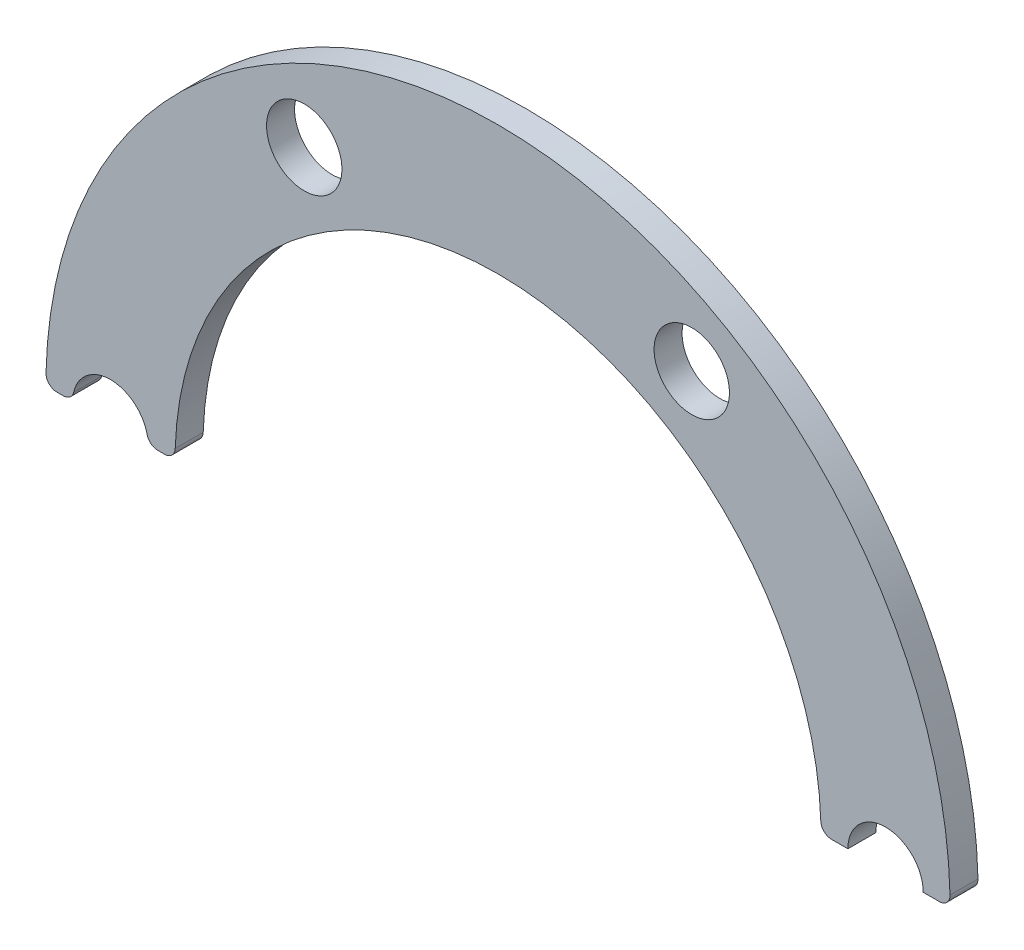
ISO-10303-21;
HEADER;
FILE_DESCRIPTION(('STEP AP214'),'2;1');
FILE_NAME('part.step','',(''),(''),'','','');
FILE_SCHEMA(('AUTOMOTIVE_DESIGN { 1 0 10303 214 1 1 1 1 }'));
ENDSEC;
DATA;
#1=APPLICATION_CONTEXT('core data for automotive mechanical design processes');
#2=APPLICATION_PROTOCOL_DEFINITION('international standard','automotive_design',2000,#1);
#3=PRODUCT_CONTEXT('',#1,'mechanical');
#4=PRODUCT('Part','Part','',(#3));
#5=PRODUCT_RELATED_PRODUCT_CATEGORY('part','',(#4));
#6=PRODUCT_DEFINITION_FORMATION('','',#4);
#7=PRODUCT_DEFINITION_CONTEXT('part definition',#1,'design');
#8=PRODUCT_DEFINITION('design','',#6,#7);
#9=PRODUCT_DEFINITION_SHAPE('','',#8);
#10=(LENGTH_UNIT() NAMED_UNIT(*) SI_UNIT(.MILLI.,.METRE.));
#11=(NAMED_UNIT(*) PLANE_ANGLE_UNIT() SI_UNIT($,.RADIAN.));
#12=(NAMED_UNIT(*) SI_UNIT($,.STERADIAN.) SOLID_ANGLE_UNIT());
#13=UNCERTAINTY_MEASURE_WITH_UNIT(LENGTH_MEASURE(1.E-05),#10,'distance_accuracy_value','');
#14=(GEOMETRIC_REPRESENTATION_CONTEXT(3) GLOBAL_UNCERTAINTY_ASSIGNED_CONTEXT((#13)) GLOBAL_UNIT_ASSIGNED_CONTEXT((#10,
#11,#12)) REPRESENTATION_CONTEXT('',''));
#15=CARTESIAN_POINT('',(0.,0.,0.));
#16=DIRECTION('',(0.,0.,1.));
#17=DIRECTION('',(1.,0.,0.));
#18=AXIS2_PLACEMENT_3D('',#15,#16,#17);
#19=CARTESIAN_POINT('',(38.1,0.,3.302));
#20=DIRECTION('',(0.,1.,0.));
#21=DIRECTION('',(-1.,0.,0.));
#22=AXIS2_PLACEMENT_3D('',#19,#20,#21);
#23=PLANE('',#22);
#24=DIRECTION('',(1.,0.,0.));
#25=VECTOR('',#24,1.);
#26=CARTESIAN_POINT('',(38.1,0.,3.302));
#27=LINE('',#26,#25);
#28=CARTESIAN_POINT('',(39.3495107974674,0.,3.302));
#29=VERTEX_POINT('',#28);
#30=CARTESIAN_POINT('',(41.275,0.,3.302));
#31=VERTEX_POINT('',#30);
#32=EDGE_CURVE('E248',#29,#31,#27,.T.);
#33=ORIENTED_EDGE('',*,*,#32,.F.);
#34=DIRECTION('',(0.,0.,-1.));
#35=VECTOR('',#34,1.);
#36=CARTESIAN_POINT('',(39.3495107974674,0.,3.302));
#37=LINE('',#36,#35);
#38=CARTESIAN_POINT('',(39.3495107974674,0.,0.));
#39=VERTEX_POINT('',#38);
#40=EDGE_CURVE('E207',#29,#39,#37,.T.);
#41=ORIENTED_EDGE('',*,*,#40,.T.);
#42=DIRECTION('',(1.,0.,0.));
#43=VECTOR('',#42,1.);
#44=CARTESIAN_POINT('',(38.1,0.,0.));
#45=LINE('',#44,#43);
#46=CARTESIAN_POINT('',(41.275,0.,0.));
#47=VERTEX_POINT('',#46);
#48=EDGE_CURVE('E164',#39,#47,#45,.T.);
#49=ORIENTED_EDGE('',*,*,#48,.T.);
#50=DIRECTION('',(0.,0.,1.));
#51=VECTOR('',#50,1.);
#52=CARTESIAN_POINT('',(41.275,0.,0.));
#53=LINE('',#52,#51);
#54=EDGE_CURVE('E144',#47,#31,#53,.T.);
#55=ORIENTED_EDGE('',*,*,#54,.T.);
#56=EDGE_LOOP('',(#33,#41,#49,#55));
#57=FACE_BOUND('',#56,.T.);
#58=ADVANCED_FACE('F34',(#57),#23,.F.);
#59=CARTESIAN_POINT('',(-38.1,0.,3.302));
#60=DIRECTION('',(0.,1.,0.));
#61=DIRECTION('',(-1.,0.,0.));
#62=AXIS2_PLACEMENT_3D('',#59,#60,#61);
#63=PLANE('',#62);
#64=DIRECTION('',(1.,0.,0.));
#65=VECTOR('',#64,1.);
#66=CARTESIAN_POINT('',(-38.1,0.,0.));
#67=LINE('',#66,#65);
#68=CARTESIAN_POINT('',(-52.0545098910748,0.,0.));
#69=VERTEX_POINT('',#68);
#70=CARTESIAN_POINT('',(-51.292102385994,0.,0.));
#71=VERTEX_POINT('',#70);
#72=EDGE_CURVE('E175',#69,#71,#67,.T.);
#73=ORIENTED_EDGE('',*,*,#72,.T.);
#74=DIRECTION('',(0.,0.,1.));
#75=VECTOR('',#74,1.);
#76=CARTESIAN_POINT('',(-51.292102385994,0.,3.302));
#77=LINE('',#76,#75);
#78=CARTESIAN_POINT('',(-51.292102385994,0.,3.302));
#79=VERTEX_POINT('',#78);
#80=EDGE_CURVE('E11',#71,#79,#77,.T.);
#81=ORIENTED_EDGE('',*,*,#80,.T.);
#82=DIRECTION('',(1.,0.,0.));
#83=VECTOR('',#82,1.);
#84=CARTESIAN_POINT('',(-38.1,0.,3.302));
#85=LINE('',#84,#83);
#86=CARTESIAN_POINT('',(-52.0545098910748,0.,3.302));
#87=VERTEX_POINT('',#86);
#88=EDGE_CURVE('E149',#87,#79,#85,.T.);
#89=ORIENTED_EDGE('',*,*,#88,.F.);
#90=DIRECTION('',(0.,0.,-1.));
#91=VECTOR('',#90,1.);
#92=CARTESIAN_POINT('',(-52.0545098910748,0.,3.302));
#93=LINE('',#92,#91);
#94=EDGE_CURVE('E42',#87,#69,#93,.T.);
#95=ORIENTED_EDGE('',*,*,#94,.T.);
#96=EDGE_LOOP('',(#73,#81,#89,#95));
#97=FACE_BOUND('',#96,.T.);
#98=ADVANCED_FACE('F227',(#97),#63,.F.);
#99=CARTESIAN_POINT('',(0.,0.,3.302));
#100=DIRECTION('',(0.,0.,-1.));
#101=DIRECTION('',(-1.,0.,0.));
#102=AXIS2_PLACEMENT_3D('',#99,#100,#101);
#103=CYLINDRICAL_SURFACE('',#102,38.1);
#104=CARTESIAN_POINT('',(0.,0.,0.));
#105=DIRECTION('',(0.,0.,-1.));
#106=DIRECTION('',(1.,0.,0.));
#107=AXIS2_PLACEMENT_3D('',#104,#105,#106);
#108=CIRCLE('',#107,38.1);
#109=CARTESIAN_POINT('',(-38.0801717394845,1.22903225806452,0.));
#110=VERTEX_POINT('',#109);
#111=CARTESIAN_POINT('',(38.0801717394845,1.22903225806452,0.));
#112=VERTEX_POINT('',#111);
#113=EDGE_CURVE('E165',#110,#112,#108,.T.);
#114=ORIENTED_EDGE('',*,*,#113,.T.);
#115=DIRECTION('',(0.,0.,-1.));
#116=VECTOR('',#115,1.);
#117=CARTESIAN_POINT('',(38.0801717394845,1.22903225806452,3.302));
#118=LINE('',#117,#116);
#119=CARTESIAN_POINT('',(38.0801717394845,1.22903225806452,3.302));
#120=VERTEX_POINT('',#119);
#121=EDGE_CURVE('E57',#112,#120,#118,.F.);
#122=ORIENTED_EDGE('',*,*,#121,.T.);
#123=CARTESIAN_POINT('',(0.,0.,3.302));
#124=DIRECTION('',(0.,0.,-1.));
#125=DIRECTION('',(1.,0.,0.));
#126=AXIS2_PLACEMENT_3D('',#123,#124,#125);
#127=CIRCLE('',#126,38.1);
#128=CARTESIAN_POINT('',(-38.0801717394845,1.22903225806452,3.302));
#129=VERTEX_POINT('',#128);
#130=EDGE_CURVE('E177',#129,#120,#127,.T.);
#131=ORIENTED_EDGE('',*,*,#130,.F.);
#132=DIRECTION('',(0.,0.,-1.));
#133=VECTOR('',#132,1.);
#134=CARTESIAN_POINT('',(-38.0801717394845,1.22903225806452,3.302));
#135=LINE('',#134,#133);
#136=EDGE_CURVE('E210',#129,#110,#135,.T.);
#137=ORIENTED_EDGE('',*,*,#136,.T.);
#138=EDGE_LOOP('',(#114,#122,#131,#137));
#139=FACE_BOUND('',#138,.T.);
#140=ADVANCED_FACE('F297',(#139),#103,.F.);
#141=CARTESIAN_POINT('',(50.165,0.,0.));
#142=VERTEX_POINT('',#141);
#143=CARTESIAN_POINT('',(52.0545098910748,0.,0.));
#144=VERTEX_POINT('',#143);
#145=EDGE_CURVE('E155',#142,#144,#45,.T.);
#146=ORIENTED_EDGE('',*,*,#145,.T.);
#147=DIRECTION('',(0.,0.,-1.));
#148=VECTOR('',#147,1.);
#149=CARTESIAN_POINT('',(52.0545098910748,0.,3.302));
#150=LINE('',#149,#148);
#151=CARTESIAN_POINT('',(52.0545098910748,0.,3.302));
#152=VERTEX_POINT('',#151);
#153=EDGE_CURVE('E194',#144,#152,#150,.F.);
#154=ORIENTED_EDGE('',*,*,#153,.T.);
#155=CARTESIAN_POINT('',(50.165,0.,3.302));
#156=VERTEX_POINT('',#155);
#157=EDGE_CURVE('E158',#156,#152,#27,.T.);
#158=ORIENTED_EDGE('',*,*,#157,.F.);
#159=DIRECTION('',(0.,0.,1.));
#160=VECTOR('',#159,1.);
#161=CARTESIAN_POINT('',(50.165,0.,0.));
#162=LINE('',#161,#160);
#163=EDGE_CURVE('E141',#156,#142,#162,.F.);
#164=ORIENTED_EDGE('',*,*,#163,.T.);
#165=EDGE_LOOP('',(#146,#154,#158,#164));
#166=FACE_BOUND('',#165,.T.);
#167=ADVANCED_FACE('F154',(#166),#23,.F.);
#168=CARTESIAN_POINT('',(0.,0.,3.302));
#169=DIRECTION('',(0.,0.,-1.));
#170=DIRECTION('',(-1.,0.,0.));
#171=AXIS2_PLACEMENT_3D('',#168,#169,#170);
#172=CYLINDRICAL_SURFACE('',#171,53.34);
#173=CARTESIAN_POINT('',(0.,0.,3.302));
#174=DIRECTION('',(0.,0.,1.));
#175=DIRECTION('',(1.,0.,0.));
#176=AXIS2_PLACEMENT_3D('',#173,#174,#175);
#177=CIRCLE('',#176,53.34);
#178=CARTESIAN_POINT('',(53.32413208354,1.30097560975609,3.302));
#179=VERTEX_POINT('',#178);
#180=CARTESIAN_POINT('',(-53.32413208354,1.30097560975609,3.302));
#181=VERTEX_POINT('',#180);
#182=EDGE_CURVE('E245',#179,#181,#177,.T.);
#183=ORIENTED_EDGE('',*,*,#182,.F.);
#184=DIRECTION('',(0.,0.,-1.));
#185=VECTOR('',#184,1.);
#186=CARTESIAN_POINT('',(53.32413208354,1.30097560975609,3.302));
#187=LINE('',#186,#185);
#188=CARTESIAN_POINT('',(53.32413208354,1.30097560975609,0.));
#189=VERTEX_POINT('',#188);
#190=EDGE_CURVE('E180',#179,#189,#187,.T.);
#191=ORIENTED_EDGE('',*,*,#190,.T.);
#192=CARTESIAN_POINT('',(0.,0.,0.));
#193=DIRECTION('',(0.,0.,1.));
#194=DIRECTION('',(1.,0.,0.));
#195=AXIS2_PLACEMENT_3D('',#192,#193,#194);
#196=CIRCLE('',#195,53.34);
#197=CARTESIAN_POINT('',(-53.32413208354,1.30097560975609,0.));
#198=VERTEX_POINT('',#197);
#199=EDGE_CURVE('E167',#189,#198,#196,.T.);
#200=ORIENTED_EDGE('',*,*,#199,.T.);
#201=DIRECTION('',(0.,0.,-1.));
#202=VECTOR('',#201,1.);
#203=CARTESIAN_POINT('',(-53.32413208354,1.30097560975609,3.302));
#204=LINE('',#203,#202);
#205=EDGE_CURVE('E148',#198,#181,#204,.F.);
#206=ORIENTED_EDGE('',*,*,#205,.T.);
#207=EDGE_LOOP('',(#183,#191,#200,#206));
#208=FACE_BOUND('',#207,.T.);
#209=ADVANCED_FACE('F287',(#208),#172,.T.);
#210=CARTESIAN_POINT('',(-40.147897614006,0.,3.302));
#211=VERTEX_POINT('',#210);
#212=CARTESIAN_POINT('',(-39.3495107974674,0.,3.302));
#213=VERTEX_POINT('',#212);
#214=EDGE_CURVE('E243',#211,#213,#85,.T.);
#215=ORIENTED_EDGE('',*,*,#214,.F.);
#216=DIRECTION('',(0.,0.,1.));
#217=VECTOR('',#216,1.);
#218=CARTESIAN_POINT('',(-40.147897614006,0.,3.302));
#219=LINE('',#218,#217);
#220=CARTESIAN_POINT('',(-40.147897614006,0.,0.));
#221=VERTEX_POINT('',#220);
#222=EDGE_CURVE('E216',#211,#221,#219,.F.);
#223=ORIENTED_EDGE('',*,*,#222,.T.);
#224=CARTESIAN_POINT('',(-39.3495107974674,0.,0.));
#225=VERTEX_POINT('',#224);
#226=EDGE_CURVE('E174',#221,#225,#67,.T.);
#227=ORIENTED_EDGE('',*,*,#226,.T.);
#228=DIRECTION('',(0.,0.,-1.));
#229=VECTOR('',#228,1.);
#230=CARTESIAN_POINT('',(-39.3495107974674,0.,3.302));
#231=LINE('',#230,#229);
#232=EDGE_CURVE('E214',#225,#213,#231,.F.);
#233=ORIENTED_EDGE('',*,*,#232,.T.);
#234=EDGE_LOOP('',(#215,#223,#227,#233));
#235=FACE_BOUND('',#234,.T.);
#236=ADVANCED_FACE('F279',(#235),#63,.F.);
#237=CARTESIAN_POINT('',(0.,0.,3.302));
#238=DIRECTION('',(0.,0.,1.));
#239=DIRECTION('',(1.,0.,0.));
#240=AXIS2_PLACEMENT_3D('',#237,#238,#239);
#241=PLANE('',#240);
#242=CARTESIAN_POINT('',(22.8600000000002,39.5946814610244,3.302));
#243=DIRECTION('',(0.,0.,1.));
#244=DIRECTION('',(-0.500000000000004,-0.866025403784436,0.));
#245=AXIS2_PLACEMENT_3D('',#242,#243,#244);
#246=CIRCLE('',#245,4.445);
#247=CARTESIAN_POINT('',(20.6375000000002,35.7451985412026,3.302));
#248=VERTEX_POINT('',#247);
#249=EDGE_CURVE('E263',#248,#248,#246,.T.);
#250=ORIENTED_EDGE('',*,*,#249,.F.);
#251=EDGE_LOOP('',(#250));
#252=FACE_BOUND('',#251,.T.);
#253=ORIENTED_EDGE('',*,*,#157,.T.);
#254=CARTESIAN_POINT('',(52.0545098910748,1.27,3.302));
#255=DIRECTION('',(0.,0.,1.));
#256=DIRECTION('',(1.,0.,0.));
#257=AXIS2_PLACEMENT_3D('',#254,#255,#256);
#258=CIRCLE('',#257,1.27);
#259=EDGE_CURVE('E205',#152,#179,#258,.T.);
#260=ORIENTED_EDGE('',*,*,#259,.T.);
#261=ORIENTED_EDGE('',*,*,#182,.T.);
#262=CARTESIAN_POINT('',(-52.0545098910748,1.27,3.302));
#263=DIRECTION('',(0.,0.,1.));
#264=DIRECTION('',(1.,0.,0.));
#265=AXIS2_PLACEMENT_3D('',#262,#263,#264);
#266=CIRCLE('',#265,1.27);
#267=EDGE_CURVE('E196',#181,#87,#266,.T.);
#268=ORIENTED_EDGE('',*,*,#267,.T.);
#269=ORIENTED_EDGE('',*,*,#88,.T.);
#270=CARTESIAN_POINT('',(-51.292102385994,1.27,3.302));
#271=DIRECTION('',(0.,0.,1.));
#272=DIRECTION('',(1.,0.,0.));
#273=AXIS2_PLACEMENT_3D('',#270,#271,#272);
#274=CIRCLE('',#273,1.27);
#275=CARTESIAN_POINT('',(-50.0538574113287,0.987777777777774,3.302));
#276=VERTEX_POINT('',#275);
#277=EDGE_CURVE('E200',#79,#276,#274,.T.);
#278=ORIENTED_EDGE('',*,*,#277,.T.);
#279=CARTESIAN_POINT('',(-45.72,0.,3.302));
#280=DIRECTION('',(0.,0.,1.));
#281=DIRECTION('',(1.,0.,0.));
#282=AXIS2_PLACEMENT_3D('',#279,#280,#281);
#283=CIRCLE('',#282,4.445);
#284=CARTESIAN_POINT('',(-41.3861425886713,0.987777777777776,3.302));
#285=VERTEX_POINT('',#284);
#286=EDGE_CURVE('E251',#285,#276,#283,.T.);
#287=ORIENTED_EDGE('',*,*,#286,.F.);
#288=CARTESIAN_POINT('',(-40.147897614006,1.27,3.302));
#289=DIRECTION('',(0.,0.,1.));
#290=DIRECTION('',(1.,0.,0.));
#291=AXIS2_PLACEMENT_3D('',#288,#289,#290);
#292=CIRCLE('',#291,1.27);
#293=EDGE_CURVE('E202',#285,#211,#292,.T.);
#294=ORIENTED_EDGE('',*,*,#293,.T.);
#295=ORIENTED_EDGE('',*,*,#214,.T.);
#296=CARTESIAN_POINT('',(-39.3495107974674,1.27,3.302));
#297=DIRECTION('',(0.,0.,1.));
#298=DIRECTION('',(1.,0.,0.));
#299=AXIS2_PLACEMENT_3D('',#296,#297,#298);
#300=CIRCLE('',#299,1.27);
#301=EDGE_CURVE('E198',#213,#129,#300,.T.);
#302=ORIENTED_EDGE('',*,*,#301,.T.);
#303=ORIENTED_EDGE('',*,*,#130,.T.);
#304=CARTESIAN_POINT('',(39.3495107974674,1.27,3.302));
#305=DIRECTION('',(0.,0.,1.));
#306=DIRECTION('',(1.,0.,0.));
#307=AXIS2_PLACEMENT_3D('',#304,#305,#306);
#308=CIRCLE('',#307,1.27);
#309=EDGE_CURVE('E49',#120,#29,#308,.T.);
#310=ORIENTED_EDGE('',*,*,#309,.T.);
#311=ORIENTED_EDGE('',*,*,#32,.T.);
#312=CARTESIAN_POINT('',(45.72,0.,3.302));
#313=DIRECTION('',(0.,0.,1.));
#314=DIRECTION('',(-1.,0.,0.));
#315=AXIS2_PLACEMENT_3D('',#312,#313,#314);
#316=CIRCLE('',#315,4.445);
#317=EDGE_CURVE('E261',#156,#31,#316,.T.);
#318=ORIENTED_EDGE('',*,*,#317,.F.);
#319=EDGE_LOOP('',(#253,#260,#261,#268,#269,#278,#287,#294,#295,#302,#303,#310,#311,#318));
#320=FACE_BOUND('',#319,.T.);
#321=CARTESIAN_POINT('',(-22.8599999999999,39.5946814610246,3.302));
#322=DIRECTION('',(0.,0.,1.));
#323=DIRECTION('',(0.499999999999998,-0.86602540378444,0.));
#324=AXIS2_PLACEMENT_3D('',#321,#322,#323);
#325=CIRCLE('',#324,4.445);
#326=CARTESIAN_POINT('',(-20.6374999999999,35.7451985412028,3.302));
#327=VERTEX_POINT('',#326);
#328=EDGE_CURVE('E255',#327,#327,#325,.T.);
#329=ORIENTED_EDGE('',*,*,#328,.F.);
#330=EDGE_LOOP('',(#329));
#331=FACE_BOUND('',#330,.T.);
#332=ADVANCED_FACE('F238',(#252,#320,#331),#241,.T.);
#333=CARTESIAN_POINT('',(0.,0.,0.));
#334=DIRECTION('',(0.,0.,1.));
#335=DIRECTION('',(1.,0.,0.));
#336=AXIS2_PLACEMENT_3D('',#333,#334,#335);
#337=PLANE('',#336);
#338=CARTESIAN_POINT('',(22.8600000000002,39.5946814610244,0.));
#339=DIRECTION('',(0.,0.,1.));
#340=DIRECTION('',(-0.500000000000004,-0.866025403784436,0.));
#341=AXIS2_PLACEMENT_3D('',#338,#339,#340);
#342=CIRCLE('',#341,4.445);
#343=CARTESIAN_POINT('',(20.6375000000002,35.7451985412026,0.));
#344=VERTEX_POINT('',#343);
#345=EDGE_CURVE('E159',#344,#344,#342,.T.);
#346=ORIENTED_EDGE('',*,*,#345,.T.);
#347=EDGE_LOOP('',(#346));
#348=FACE_BOUND('',#347,.T.);
#349=CARTESIAN_POINT('',(-22.8599999999999,39.5946814610246,0.));
#350=DIRECTION('',(0.,0.,1.));
#351=DIRECTION('',(0.499999999999998,-0.86602540378444,0.));
#352=AXIS2_PLACEMENT_3D('',#349,#350,#351);
#353=CIRCLE('',#352,4.445);
#354=CARTESIAN_POINT('',(-20.6374999999999,35.7451985412028,0.));
#355=VERTEX_POINT('',#354);
#356=EDGE_CURVE('E253',#355,#355,#353,.T.);
#357=ORIENTED_EDGE('',*,*,#356,.T.);
#358=EDGE_LOOP('',(#357));
#359=FACE_BOUND('',#358,.T.);
#360=ORIENTED_EDGE('',*,*,#199,.F.);
#361=CARTESIAN_POINT('',(52.0545098910748,1.27,0.));
#362=DIRECTION('',(0.,0.,1.));
#363=DIRECTION('',(1.,0.,0.));
#364=AXIS2_PLACEMENT_3D('',#361,#362,#363);
#365=CIRCLE('',#364,1.27);
#366=EDGE_CURVE('E163',#189,#144,#365,.F.);
#367=ORIENTED_EDGE('',*,*,#366,.T.);
#368=ORIENTED_EDGE('',*,*,#145,.F.);
#369=CARTESIAN_POINT('',(45.72,0.,0.));
#370=DIRECTION('',(0.,0.,1.));
#371=DIRECTION('',(1.,0.,0.));
#372=AXIS2_PLACEMENT_3D('',#369,#370,#371);
#373=CIRCLE('',#372,4.445);
#374=EDGE_CURVE('E137',#142,#47,#373,.T.);
#375=ORIENTED_EDGE('',*,*,#374,.T.);
#376=ORIENTED_EDGE('',*,*,#48,.F.);
#377=CARTESIAN_POINT('',(39.3495107974674,1.27,0.));
#378=DIRECTION('',(0.,0.,1.));
#379=DIRECTION('',(1.,0.,0.));
#380=AXIS2_PLACEMENT_3D('',#377,#378,#379);
#381=CIRCLE('',#380,1.27);
#382=EDGE_CURVE('E191',#39,#112,#381,.F.);
#383=ORIENTED_EDGE('',*,*,#382,.T.);
#384=ORIENTED_EDGE('',*,*,#113,.F.);
#385=CARTESIAN_POINT('',(-39.3495107974674,1.27,0.));
#386=DIRECTION('',(0.,0.,1.));
#387=DIRECTION('',(1.,0.,0.));
#388=AXIS2_PLACEMENT_3D('',#385,#386,#387);
#389=CIRCLE('',#388,1.27);
#390=EDGE_CURVE('E185',#110,#225,#389,.F.);
#391=ORIENTED_EDGE('',*,*,#390,.T.);
#392=ORIENTED_EDGE('',*,*,#226,.F.);
#393=CARTESIAN_POINT('',(-40.147897614006,1.27,0.));
#394=DIRECTION('',(0.,0.,1.));
#395=DIRECTION('',(1.,0.,0.));
#396=AXIS2_PLACEMENT_3D('',#393,#394,#395);
#397=CIRCLE('',#396,1.27);
#398=CARTESIAN_POINT('',(-41.3861425886713,0.987777777777776,0.));
#399=VERTEX_POINT('',#398);
#400=EDGE_CURVE('E189',#221,#399,#397,.F.);
#401=ORIENTED_EDGE('',*,*,#400,.T.);
#402=CARTESIAN_POINT('',(-45.72,0.,0.));
#403=DIRECTION('',(0.,0.,1.));
#404=DIRECTION('',(1.,0.,0.));
#405=AXIS2_PLACEMENT_3D('',#402,#403,#404);
#406=CIRCLE('',#405,4.445);
#407=CARTESIAN_POINT('',(-50.0538574113287,0.987777777777774,0.));
#408=VERTEX_POINT('',#407);
#409=EDGE_CURVE('E168',#399,#408,#406,.T.);
#410=ORIENTED_EDGE('',*,*,#409,.T.);
#411=CARTESIAN_POINT('',(-51.292102385994,1.27,0.));
#412=DIRECTION('',(0.,0.,1.));
#413=DIRECTION('',(1.,0.,0.));
#414=AXIS2_PLACEMENT_3D('',#411,#412,#413);
#415=CIRCLE('',#414,1.27);
#416=EDGE_CURVE('E187',#408,#71,#415,.F.);
#417=ORIENTED_EDGE('',*,*,#416,.T.);
#418=ORIENTED_EDGE('',*,*,#72,.F.);
#419=CARTESIAN_POINT('',(-52.0545098910748,1.27,0.));
#420=DIRECTION('',(0.,0.,1.));
#421=DIRECTION('',(1.,0.,0.));
#422=AXIS2_PLACEMENT_3D('',#419,#420,#421);
#423=CIRCLE('',#422,1.27);
#424=EDGE_CURVE('E183',#69,#198,#423,.F.);
#425=ORIENTED_EDGE('',*,*,#424,.T.);
#426=EDGE_LOOP('',(#360,#367,#368,#375,#376,#383,#384,#391,#392,#401,#410,#417,#418,#425));
#427=FACE_BOUND('',#426,.T.);
#428=ADVANCED_FACE('F162',(#348,#359,#427),#337,.F.);
#429=CARTESIAN_POINT('',(-45.72,0.,0.));
#430=DIRECTION('',(0.,0.,1.));
#431=DIRECTION('',(1.,0.,0.));
#432=AXIS2_PLACEMENT_3D('',#429,#430,#431);
#433=CYLINDRICAL_SURFACE('',#432,4.445);
#434=ORIENTED_EDGE('',*,*,#409,.F.);
#435=DIRECTION('',(0.,0.,1.));
#436=VECTOR('',#435,1.);
#437=CARTESIAN_POINT('',(-41.3861425886713,0.987777777777776,0.));
#438=LINE('',#437,#436);
#439=EDGE_CURVE('E221',#399,#285,#438,.T.);
#440=ORIENTED_EDGE('',*,*,#439,.T.);
#441=ORIENTED_EDGE('',*,*,#286,.T.);
#442=DIRECTION('',(0.,0.,1.));
#443=VECTOR('',#442,1.);
#444=CARTESIAN_POINT('',(-50.0538574113287,0.987777777777775,0.));
#445=LINE('',#444,#443);
#446=EDGE_CURVE('E219',#276,#408,#445,.F.);
#447=ORIENTED_EDGE('',*,*,#446,.T.);
#448=EDGE_LOOP('',(#434,#440,#441,#447));
#449=FACE_BOUND('',#448,.T.);
#450=ADVANCED_FACE('F285',(#449),#433,.F.);
#451=CARTESIAN_POINT('',(-22.8599999999999,39.5946814610246,0.));
#452=DIRECTION('',(0.,0.,1.));
#453=DIRECTION('',(1.,0.,0.));
#454=AXIS2_PLACEMENT_3D('',#451,#452,#453);
#455=CYLINDRICAL_SURFACE('',#454,4.445);
#456=ORIENTED_EDGE('',*,*,#356,.F.);
#457=EDGE_LOOP('',(#456));
#458=FACE_BOUND('',#457,.T.);
#459=ORIENTED_EDGE('',*,*,#328,.T.);
#460=EDGE_LOOP('',(#459));
#461=FACE_BOUND('',#460,.T.);
#462=ADVANCED_FACE('F344',(#458,#461),#455,.F.);
#463=CARTESIAN_POINT('',(45.72,0.,0.));
#464=DIRECTION('',(0.,0.,1.));
#465=DIRECTION('',(1.,0.,0.));
#466=AXIS2_PLACEMENT_3D('',#463,#464,#465);
#467=CYLINDRICAL_SURFACE('',#466,4.445);
#468=ORIENTED_EDGE('',*,*,#374,.F.);
#469=ORIENTED_EDGE('',*,*,#163,.F.);
#470=ORIENTED_EDGE('',*,*,#317,.T.);
#471=ORIENTED_EDGE('',*,*,#54,.F.);
#472=EDGE_LOOP('',(#468,#469,#470,#471));
#473=FACE_BOUND('',#472,.T.);
#474=ADVANCED_FACE('F139',(#473),#467,.F.);
#475=CARTESIAN_POINT('',(22.8600000000002,39.5946814610244,0.));
#476=DIRECTION('',(0.,0.,1.));
#477=DIRECTION('',(1.,0.,0.));
#478=AXIS2_PLACEMENT_3D('',#475,#476,#477);
#479=CYLINDRICAL_SURFACE('',#478,4.445);
#480=ORIENTED_EDGE('',*,*,#345,.F.);
#481=EDGE_LOOP('',(#480));
#482=FACE_BOUND('',#481,.T.);
#483=ORIENTED_EDGE('',*,*,#249,.T.);
#484=EDGE_LOOP('',(#483));
#485=FACE_BOUND('',#484,.T.);
#486=ADVANCED_FACE('F271',(#482,#485),#479,.F.);
#487=CARTESIAN_POINT('',(52.0545098910748,1.27,3.302));
#488=DIRECTION('',(0.,0.,-1.));
#489=DIRECTION('',(-1.,0.,0.));
#490=AXIS2_PLACEMENT_3D('',#487,#488,#489);
#491=CYLINDRICAL_SURFACE('',#490,1.27);
#492=ORIENTED_EDGE('',*,*,#259,.F.);
#493=ORIENTED_EDGE('',*,*,#153,.F.);
#494=ORIENTED_EDGE('',*,*,#366,.F.);
#495=ORIENTED_EDGE('',*,*,#190,.F.);
#496=EDGE_LOOP('',(#492,#493,#494,#495));
#497=FACE_BOUND('',#496,.T.);
#498=ADVANCED_FACE('F274',(#497),#491,.T.);
#499=CARTESIAN_POINT('',(39.3495107974674,1.27,3.302));
#500=DIRECTION('',(0.,0.,-1.));
#501=DIRECTION('',(-1.,0.,0.));
#502=AXIS2_PLACEMENT_3D('',#499,#500,#501);
#503=CYLINDRICAL_SURFACE('',#502,1.27);
#504=ORIENTED_EDGE('',*,*,#309,.F.);
#505=ORIENTED_EDGE('',*,*,#121,.F.);
#506=ORIENTED_EDGE('',*,*,#382,.F.);
#507=ORIENTED_EDGE('',*,*,#40,.F.);
#508=EDGE_LOOP('',(#504,#505,#506,#507));
#509=FACE_BOUND('',#508,.T.);
#510=ADVANCED_FACE('F311',(#509),#503,.T.);
#511=CARTESIAN_POINT('',(-40.147897614006,1.27,0.));
#512=DIRECTION('',(0.,0.,1.));
#513=DIRECTION('',(1.,0.,0.));
#514=AXIS2_PLACEMENT_3D('',#511,#512,#513);
#515=CYLINDRICAL_SURFACE('',#514,1.27);
#516=ORIENTED_EDGE('',*,*,#293,.F.);
#517=ORIENTED_EDGE('',*,*,#439,.F.);
#518=ORIENTED_EDGE('',*,*,#400,.F.);
#519=ORIENTED_EDGE('',*,*,#222,.F.);
#520=EDGE_LOOP('',(#516,#517,#518,#519));
#521=FACE_BOUND('',#520,.T.);
#522=ADVANCED_FACE('F315',(#521),#515,.T.);
#523=CARTESIAN_POINT('',(-51.292102385994,1.27,0.));
#524=DIRECTION('',(0.,0.,1.));
#525=DIRECTION('',(1.,0.,0.));
#526=AXIS2_PLACEMENT_3D('',#523,#524,#525);
#527=CYLINDRICAL_SURFACE('',#526,1.27);
#528=ORIENTED_EDGE('',*,*,#416,.F.);
#529=ORIENTED_EDGE('',*,*,#446,.F.);
#530=ORIENTED_EDGE('',*,*,#277,.F.);
#531=ORIENTED_EDGE('',*,*,#80,.F.);
#532=EDGE_LOOP('',(#528,#529,#530,#531));
#533=FACE_BOUND('',#532,.T.);
#534=ADVANCED_FACE('F237',(#533),#527,.T.);
#535=CARTESIAN_POINT('',(-39.3495107974674,1.27,3.302));
#536=DIRECTION('',(0.,0.,-1.));
#537=DIRECTION('',(-1.,0.,0.));
#538=AXIS2_PLACEMENT_3D('',#535,#536,#537);
#539=CYLINDRICAL_SURFACE('',#538,1.27);
#540=ORIENTED_EDGE('',*,*,#301,.F.);
#541=ORIENTED_EDGE('',*,*,#232,.F.);
#542=ORIENTED_EDGE('',*,*,#390,.F.);
#543=ORIENTED_EDGE('',*,*,#136,.F.);
#544=EDGE_LOOP('',(#540,#541,#542,#543));
#545=FACE_BOUND('',#544,.T.);
#546=ADVANCED_FACE('F321',(#545),#539,.T.);
#547=CARTESIAN_POINT('',(-52.0545098910748,1.27,3.302));
#548=DIRECTION('',(0.,0.,-1.));
#549=DIRECTION('',(-1.,0.,0.));
#550=AXIS2_PLACEMENT_3D('',#547,#548,#549);
#551=CYLINDRICAL_SURFACE('',#550,1.27);
#552=ORIENTED_EDGE('',*,*,#267,.F.);
#553=ORIENTED_EDGE('',*,*,#205,.F.);
#554=ORIENTED_EDGE('',*,*,#424,.F.);
#555=ORIENTED_EDGE('',*,*,#94,.F.);
#556=EDGE_LOOP('',(#552,#553,#554,#555));
#557=FACE_BOUND('',#556,.T.);
#558=ADVANCED_FACE('F36',(#557),#551,.T.);
#559=CLOSED_SHELL('',(#58,#98,#140,#167,#209,#236,#332,#428,#450,#462,#474,#486,#498,#510,#522,
#534,#546,#558));
#560=MANIFOLD_SOLID_BREP('B2',#559);
#561=ADVANCED_BREP_SHAPE_REPRESENTATION('',(#18,#560),#14);
#562=SHAPE_DEFINITION_REPRESENTATION(#9,#561);
ENDSEC;
END-ISO-10303-21;
